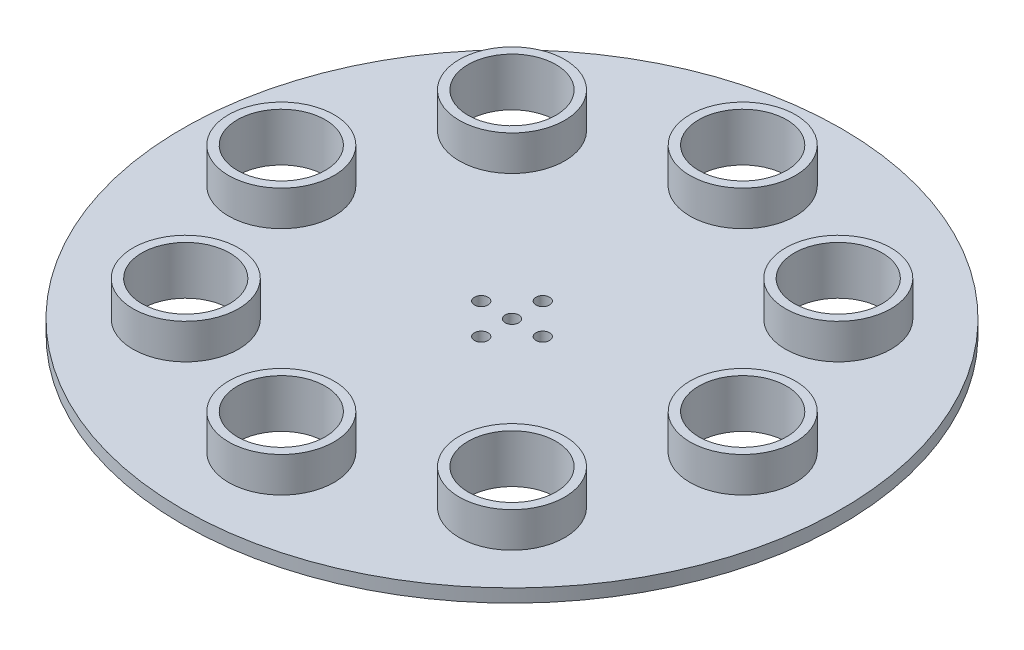
ISO-10303-21;
HEADER;
FILE_DESCRIPTION(('STEP AP214'),'2;1');
FILE_NAME('part.step','',(''),(''),'','','');
FILE_SCHEMA(('AUTOMOTIVE_DESIGN { 1 0 10303 214 1 1 1 1 }'));
ENDSEC;
DATA;
#1=APPLICATION_CONTEXT('core data for automotive mechanical design processes');
#2=APPLICATION_PROTOCOL_DEFINITION('international standard','automotive_design',2000,#1);
#3=PRODUCT_CONTEXT('',#1,'mechanical');
#4=PRODUCT('Part','Part','',(#3));
#5=PRODUCT_RELATED_PRODUCT_CATEGORY('part','',(#4));
#6=PRODUCT_DEFINITION_FORMATION('','',#4);
#7=PRODUCT_DEFINITION_CONTEXT('part definition',#1,'design');
#8=PRODUCT_DEFINITION('design','',#6,#7);
#9=PRODUCT_DEFINITION_SHAPE('','',#8);
#10=(LENGTH_UNIT() NAMED_UNIT(*) SI_UNIT(.MILLI.,.METRE.));
#11=(NAMED_UNIT(*) PLANE_ANGLE_UNIT() SI_UNIT($,.RADIAN.));
#12=(NAMED_UNIT(*) SI_UNIT($,.STERADIAN.) SOLID_ANGLE_UNIT());
#13=UNCERTAINTY_MEASURE_WITH_UNIT(LENGTH_MEASURE(1.E-05),#10,'distance_accuracy_value','');
#14=(GEOMETRIC_REPRESENTATION_CONTEXT(3) GLOBAL_UNCERTAINTY_ASSIGNED_CONTEXT((#13)) GLOBAL_UNIT_ASSIGNED_CONTEXT((#10,
#11,#12)) REPRESENTATION_CONTEXT('',''));
#15=CARTESIAN_POINT('',(0.,0.,0.));
#16=DIRECTION('',(0.,0.,1.));
#17=DIRECTION('',(1.,0.,0.));
#18=AXIS2_PLACEMENT_3D('',#15,#16,#17);
#19=CARTESIAN_POINT('',(0.,3.,0.));
#20=DIRECTION('',(0.,-1.,0.));
#21=DIRECTION('',(0.,0.,-1.));
#22=AXIS2_PLACEMENT_3D('',#19,#20,#21);
#23=CYLINDRICAL_SURFACE('',#22,1.55);
#24=CARTESIAN_POINT('',(0.,3.,0.));
#25=DIRECTION('',(0.,1.,0.));
#26=DIRECTION('',(0.,0.,1.));
#27=AXIS2_PLACEMENT_3D('',#24,#25,#26);
#28=CIRCLE('',#27,1.55);
#29=CARTESIAN_POINT('',(0.,3.,1.55));
#30=VERTEX_POINT('',#29);
#31=EDGE_CURVE('E56',#30,#30,#28,.T.);
#32=ORIENTED_EDGE('',*,*,#31,.T.);
#33=EDGE_LOOP('',(#32));
#34=FACE_BOUND('',#33,.T.);
#35=CARTESIAN_POINT('',(0.,0.,0.));
#36=DIRECTION('',(0.,1.,0.));
#37=DIRECTION('',(0.,0.,1.));
#38=AXIS2_PLACEMENT_3D('',#35,#36,#37);
#39=CIRCLE('',#38,1.55);
#40=CARTESIAN_POINT('',(0.,0.,1.55));
#41=VERTEX_POINT('',#40);
#42=EDGE_CURVE('E100',#41,#41,#39,.T.);
#43=ORIENTED_EDGE('',*,*,#42,.F.);
#44=EDGE_LOOP('',(#43));
#45=FACE_BOUND('',#44,.T.);
#46=ADVANCED_FACE('F48',(#34,#45),#23,.F.);
#47=CARTESIAN_POINT('',(0.,3.,-7.));
#48=DIRECTION('',(0.,-1.,0.));
#49=DIRECTION('',(0.,0.,-1.));
#50=AXIS2_PLACEMENT_3D('',#47,#48,#49);
#51=CYLINDRICAL_SURFACE('',#50,1.55);
#52=CARTESIAN_POINT('',(0.,3.,-7.));
#53=DIRECTION('',(0.,1.,0.));
#54=DIRECTION('',(0.,0.,1.));
#55=AXIS2_PLACEMENT_3D('',#52,#53,#54);
#56=CIRCLE('',#55,1.55);
#57=CARTESIAN_POINT('',(0.,3.,-5.45));
#58=VERTEX_POINT('',#57);
#59=EDGE_CURVE('E61',#58,#58,#56,.T.);
#60=ORIENTED_EDGE('',*,*,#59,.T.);
#61=EDGE_LOOP('',(#60));
#62=FACE_BOUND('',#61,.T.);
#63=CARTESIAN_POINT('',(0.,0.,-7.));
#64=DIRECTION('',(0.,1.,0.));
#65=DIRECTION('',(0.,0.,1.));
#66=AXIS2_PLACEMENT_3D('',#63,#64,#65);
#67=CIRCLE('',#66,1.55);
#68=CARTESIAN_POINT('',(0.,0.,-5.45));
#69=VERTEX_POINT('',#68);
#70=EDGE_CURVE('E98',#69,#69,#67,.T.);
#71=ORIENTED_EDGE('',*,*,#70,.F.);
#72=EDGE_LOOP('',(#71));
#73=FACE_BOUND('',#72,.T.);
#74=ADVANCED_FACE('F145',(#62,#73),#51,.F.);
#75=CARTESIAN_POINT('',(7.,3.,0.));
#76=DIRECTION('',(0.,-1.,0.));
#77=DIRECTION('',(0.,0.,-1.));
#78=AXIS2_PLACEMENT_3D('',#75,#76,#77);
#79=CYLINDRICAL_SURFACE('',#78,1.55);
#80=CARTESIAN_POINT('',(7.,3.,0.));
#81=DIRECTION('',(0.,1.,0.));
#82=DIRECTION('',(0.,0.,1.));
#83=AXIS2_PLACEMENT_3D('',#80,#81,#82);
#84=CIRCLE('',#83,1.55);
#85=CARTESIAN_POINT('',(7.,3.,1.55));
#86=VERTEX_POINT('',#85);
#87=EDGE_CURVE('E140',#86,#86,#84,.T.);
#88=ORIENTED_EDGE('',*,*,#87,.T.);
#89=EDGE_LOOP('',(#88));
#90=FACE_BOUND('',#89,.T.);
#91=CARTESIAN_POINT('',(7.,0.,0.));
#92=DIRECTION('',(0.,1.,0.));
#93=DIRECTION('',(0.,0.,1.));
#94=AXIS2_PLACEMENT_3D('',#91,#92,#93);
#95=CIRCLE('',#94,1.55);
#96=CARTESIAN_POINT('',(7.,0.,1.55));
#97=VERTEX_POINT('',#96);
#98=EDGE_CURVE('E95',#97,#97,#95,.T.);
#99=ORIENTED_EDGE('',*,*,#98,.F.);
#100=EDGE_LOOP('',(#99));
#101=FACE_BOUND('',#100,.T.);
#102=ADVANCED_FACE('F163',(#90,#101),#79,.F.);
#103=CARTESIAN_POINT('',(-7.,3.,0.));
#104=DIRECTION('',(0.,-1.,0.));
#105=DIRECTION('',(0.,0.,-1.));
#106=AXIS2_PLACEMENT_3D('',#103,#104,#105);
#107=CYLINDRICAL_SURFACE('',#106,1.55);
#108=CARTESIAN_POINT('',(-7.,3.,0.));
#109=DIRECTION('',(0.,1.,0.));
#110=DIRECTION('',(0.,0.,1.));
#111=AXIS2_PLACEMENT_3D('',#108,#109,#110);
#112=CIRCLE('',#111,1.55);
#113=CARTESIAN_POINT('',(-7.,3.,1.55));
#114=VERTEX_POINT('',#113);
#115=EDGE_CURVE('E137',#114,#114,#112,.T.);
#116=ORIENTED_EDGE('',*,*,#115,.T.);
#117=EDGE_LOOP('',(#116));
#118=FACE_BOUND('',#117,.T.);
#119=CARTESIAN_POINT('',(-7.,0.,0.));
#120=DIRECTION('',(0.,1.,0.));
#121=DIRECTION('',(0.,0.,1.));
#122=AXIS2_PLACEMENT_3D('',#119,#120,#121);
#123=CIRCLE('',#122,1.55);
#124=CARTESIAN_POINT('',(-7.,0.,1.55));
#125=VERTEX_POINT('',#124);
#126=EDGE_CURVE('E92',#125,#125,#123,.T.);
#127=ORIENTED_EDGE('',*,*,#126,.F.);
#128=EDGE_LOOP('',(#127));
#129=FACE_BOUND('',#128,.T.);
#130=ADVANCED_FACE('F170',(#118,#129),#107,.F.);
#131=CARTESIAN_POINT('',(0.,3.,7.));
#132=DIRECTION('',(0.,-1.,0.));
#133=DIRECTION('',(0.,0.,-1.));
#134=AXIS2_PLACEMENT_3D('',#131,#132,#133);
#135=CYLINDRICAL_SURFACE('',#134,1.55);
#136=CARTESIAN_POINT('',(0.,3.,7.));
#137=DIRECTION('',(0.,1.,0.));
#138=DIRECTION('',(0.,0.,1.));
#139=AXIS2_PLACEMENT_3D('',#136,#137,#138);
#140=CIRCLE('',#139,1.55);
#141=CARTESIAN_POINT('',(0.,3.,8.55));
#142=VERTEX_POINT('',#141);
#143=EDGE_CURVE('E134',#142,#142,#140,.T.);
#144=ORIENTED_EDGE('',*,*,#143,.T.);
#145=EDGE_LOOP('',(#144));
#146=FACE_BOUND('',#145,.T.);
#147=CARTESIAN_POINT('',(0.,0.,7.));
#148=DIRECTION('',(0.,1.,0.));
#149=DIRECTION('',(0.,0.,1.));
#150=AXIS2_PLACEMENT_3D('',#147,#148,#149);
#151=CIRCLE('',#150,1.55);
#152=CARTESIAN_POINT('',(0.,0.,8.55));
#153=VERTEX_POINT('',#152);
#154=EDGE_CURVE('E89',#153,#153,#151,.T.);
#155=ORIENTED_EDGE('',*,*,#154,.F.);
#156=EDGE_LOOP('',(#155));
#157=FACE_BOUND('',#156,.T.);
#158=ADVANCED_FACE('F174',(#146,#157),#135,.F.);
#159=CARTESIAN_POINT('',(-37.1231060122939,3.,-37.1231060122935));
#160=DIRECTION('',(0.,-1.,0.));
#161=DIRECTION('',(0.,0.,-1.));
#162=AXIS2_PLACEMENT_3D('',#159,#160,#161);
#163=CYLINDRICAL_SURFACE('',#162,12.);
#164=CARTESIAN_POINT('',(-37.1231060122939,3.,-37.1231060122935));
#165=DIRECTION('',(0.,1.,0.));
#166=DIRECTION('',(0.,0.,1.));
#167=AXIS2_PLACEMENT_3D('',#164,#165,#166);
#168=CIRCLE('',#167,12.);
#169=CARTESIAN_POINT('',(-37.1231060122939,3.,-25.1231060122935));
#170=VERTEX_POINT('',#169);
#171=EDGE_CURVE('E131',#170,#170,#168,.T.);
#172=ORIENTED_EDGE('',*,*,#171,.T.);
#173=EDGE_LOOP('',(#172));
#174=FACE_BOUND('',#173,.T.);
#175=CARTESIAN_POINT('',(-37.1231060122939,0.,-37.1231060122935));
#176=DIRECTION('',(0.,1.,0.));
#177=DIRECTION('',(0.,0.,1.));
#178=AXIS2_PLACEMENT_3D('',#175,#176,#177);
#179=CIRCLE('',#178,12.);
#180=CARTESIAN_POINT('',(-37.1231060122939,0.,-25.1231060122935));
#181=VERTEX_POINT('',#180);
#182=EDGE_CURVE('E86',#181,#181,#179,.T.);
#183=ORIENTED_EDGE('',*,*,#182,.F.);
#184=EDGE_LOOP('',(#183));
#185=FACE_BOUND('',#184,.T.);
#186=ADVANCED_FACE('F178',(#174,#185),#163,.F.);
#187=CARTESIAN_POINT('',(0.,3.,-52.5));
#188=DIRECTION('',(0.,-1.,0.));
#189=DIRECTION('',(0.,0.,-1.));
#190=AXIS2_PLACEMENT_3D('',#187,#188,#189);
#191=CYLINDRICAL_SURFACE('',#190,12.);
#192=CARTESIAN_POINT('',(0.,3.,-52.5));
#193=DIRECTION('',(0.,1.,0.));
#194=DIRECTION('',(0.,0.,1.));
#195=AXIS2_PLACEMENT_3D('',#192,#193,#194);
#196=CIRCLE('',#195,12.);
#197=CARTESIAN_POINT('',(0.,3.,-40.5));
#198=VERTEX_POINT('',#197);
#199=EDGE_CURVE('E128',#198,#198,#196,.T.);
#200=ORIENTED_EDGE('',*,*,#199,.T.);
#201=EDGE_LOOP('',(#200));
#202=FACE_BOUND('',#201,.T.);
#203=CARTESIAN_POINT('',(0.,0.,-52.5));
#204=DIRECTION('',(0.,1.,0.));
#205=DIRECTION('',(0.,0.,1.));
#206=AXIS2_PLACEMENT_3D('',#203,#204,#205);
#207=CIRCLE('',#206,12.);
#208=CARTESIAN_POINT('',(0.,0.,-40.5));
#209=VERTEX_POINT('',#208);
#210=EDGE_CURVE('E83',#209,#209,#207,.T.);
#211=ORIENTED_EDGE('',*,*,#210,.F.);
#212=EDGE_LOOP('',(#211));
#213=FACE_BOUND('',#212,.T.);
#214=ADVANCED_FACE('F182',(#202,#213),#191,.F.);
#215=CARTESIAN_POINT('',(37.1231060122937,3.,-37.1231060122938));
#216=DIRECTION('',(0.,-1.,0.));
#217=DIRECTION('',(0.,0.,-1.));
#218=AXIS2_PLACEMENT_3D('',#215,#216,#217);
#219=CYLINDRICAL_SURFACE('',#218,12.);
#220=CARTESIAN_POINT('',(37.1231060122937,3.,-37.1231060122938));
#221=DIRECTION('',(0.,1.,0.));
#222=DIRECTION('',(0.,0.,1.));
#223=AXIS2_PLACEMENT_3D('',#220,#221,#222);
#224=CIRCLE('',#223,12.);
#225=CARTESIAN_POINT('',(37.1231060122937,3.,-25.1231060122938));
#226=VERTEX_POINT('',#225);
#227=EDGE_CURVE('E125',#226,#226,#224,.T.);
#228=ORIENTED_EDGE('',*,*,#227,.T.);
#229=EDGE_LOOP('',(#228));
#230=FACE_BOUND('',#229,.T.);
#231=CARTESIAN_POINT('',(37.1231060122937,0.,-37.1231060122938));
#232=DIRECTION('',(0.,1.,0.));
#233=DIRECTION('',(0.,0.,1.));
#234=AXIS2_PLACEMENT_3D('',#231,#232,#233);
#235=CIRCLE('',#234,12.);
#236=CARTESIAN_POINT('',(37.1231060122937,0.,-25.1231060122938));
#237=VERTEX_POINT('',#236);
#238=EDGE_CURVE('E80',#237,#237,#235,.T.);
#239=ORIENTED_EDGE('',*,*,#238,.F.);
#240=EDGE_LOOP('',(#239));
#241=FACE_BOUND('',#240,.T.);
#242=ADVANCED_FACE('F186',(#230,#241),#219,.F.);
#243=CARTESIAN_POINT('',(52.5,3.,0.));
#244=DIRECTION('',(0.,-1.,0.));
#245=DIRECTION('',(0.,0.,-1.));
#246=AXIS2_PLACEMENT_3D('',#243,#244,#245);
#247=CYLINDRICAL_SURFACE('',#246,12.);
#248=CARTESIAN_POINT('',(52.5,3.,0.));
#249=DIRECTION('',(0.,1.,0.));
#250=DIRECTION('',(0.,0.,1.));
#251=AXIS2_PLACEMENT_3D('',#248,#249,#250);
#252=CIRCLE('',#251,12.);
#253=CARTESIAN_POINT('',(52.5,3.,12.));
#254=VERTEX_POINT('',#253);
#255=EDGE_CURVE('E122',#254,#254,#252,.T.);
#256=ORIENTED_EDGE('',*,*,#255,.T.);
#257=EDGE_LOOP('',(#256));
#258=FACE_BOUND('',#257,.T.);
#259=CARTESIAN_POINT('',(52.5,0.,0.));
#260=DIRECTION('',(0.,1.,0.));
#261=DIRECTION('',(0.,0.,1.));
#262=AXIS2_PLACEMENT_3D('',#259,#260,#261);
#263=CIRCLE('',#262,12.);
#264=CARTESIAN_POINT('',(52.5,0.,12.));
#265=VERTEX_POINT('',#264);
#266=EDGE_CURVE('E77',#265,#265,#263,.T.);
#267=ORIENTED_EDGE('',*,*,#266,.F.);
#268=EDGE_LOOP('',(#267));
#269=FACE_BOUND('',#268,.T.);
#270=ADVANCED_FACE('F190',(#258,#269),#247,.F.);
#271=CARTESIAN_POINT('',(37.1231060122937,3.,37.1231060122937));
#272=DIRECTION('',(0.,-1.,0.));
#273=DIRECTION('',(0.,0.,-1.));
#274=AXIS2_PLACEMENT_3D('',#271,#272,#273);
#275=CYLINDRICAL_SURFACE('',#274,12.);
#276=CARTESIAN_POINT('',(37.1231060122937,3.,37.1231060122937));
#277=DIRECTION('',(0.,1.,0.));
#278=DIRECTION('',(0.,0.,1.));
#279=AXIS2_PLACEMENT_3D('',#276,#277,#278);
#280=CIRCLE('',#279,12.);
#281=CARTESIAN_POINT('',(37.1231060122937,3.,49.1231060122937));
#282=VERTEX_POINT('',#281);
#283=EDGE_CURVE('E119',#282,#282,#280,.T.);
#284=ORIENTED_EDGE('',*,*,#283,.T.);
#285=EDGE_LOOP('',(#284));
#286=FACE_BOUND('',#285,.T.);
#287=CARTESIAN_POINT('',(37.1231060122937,0.,37.1231060122937));
#288=DIRECTION('',(0.,1.,0.));
#289=DIRECTION('',(0.,0.,1.));
#290=AXIS2_PLACEMENT_3D('',#287,#288,#289);
#291=CIRCLE('',#290,12.);
#292=CARTESIAN_POINT('',(37.1231060122937,0.,49.1231060122937));
#293=VERTEX_POINT('',#292);
#294=EDGE_CURVE('E74',#293,#293,#291,.T.);
#295=ORIENTED_EDGE('',*,*,#294,.F.);
#296=EDGE_LOOP('',(#295));
#297=FACE_BOUND('',#296,.T.);
#298=ADVANCED_FACE('F194',(#286,#297),#275,.F.);
#299=CARTESIAN_POINT('',(0.,3.,52.5));
#300=DIRECTION('',(0.,-1.,0.));
#301=DIRECTION('',(0.,0.,-1.));
#302=AXIS2_PLACEMENT_3D('',#299,#300,#301);
#303=CYLINDRICAL_SURFACE('',#302,12.);
#304=CARTESIAN_POINT('',(0.,3.,52.5));
#305=DIRECTION('',(0.,1.,0.));
#306=DIRECTION('',(0.,0.,1.));
#307=AXIS2_PLACEMENT_3D('',#304,#305,#306);
#308=CIRCLE('',#307,12.);
#309=CARTESIAN_POINT('',(0.,3.,64.5));
#310=VERTEX_POINT('',#309);
#311=EDGE_CURVE('E114',#310,#310,#308,.T.);
#312=ORIENTED_EDGE('',*,*,#311,.T.);
#313=EDGE_LOOP('',(#312));
#314=FACE_BOUND('',#313,.T.);
#315=CARTESIAN_POINT('',(0.,0.,52.5));
#316=DIRECTION('',(0.,1.,0.));
#317=DIRECTION('',(0.,0.,1.));
#318=AXIS2_PLACEMENT_3D('',#315,#316,#317);
#319=CIRCLE('',#318,12.);
#320=CARTESIAN_POINT('',(0.,0.,64.5));
#321=VERTEX_POINT('',#320);
#322=EDGE_CURVE('E71',#321,#321,#319,.T.);
#323=ORIENTED_EDGE('',*,*,#322,.F.);
#324=EDGE_LOOP('',(#323));
#325=FACE_BOUND('',#324,.T.);
#326=ADVANCED_FACE('F198',(#314,#325),#303,.F.);
#327=CARTESIAN_POINT('',(-37.1231060122938,3.,37.1231060122937));
#328=DIRECTION('',(0.,-1.,0.));
#329=DIRECTION('',(0.,0.,-1.));
#330=AXIS2_PLACEMENT_3D('',#327,#328,#329);
#331=CYLINDRICAL_SURFACE('',#330,12.);
#332=CARTESIAN_POINT('',(-37.1231060122938,3.,37.1231060122937));
#333=DIRECTION('',(0.,1.,0.));
#334=DIRECTION('',(0.,0.,1.));
#335=AXIS2_PLACEMENT_3D('',#332,#333,#334);
#336=CIRCLE('',#335,12.);
#337=CARTESIAN_POINT('',(-37.1231060122938,3.,49.1231060122937));
#338=VERTEX_POINT('',#337);
#339=EDGE_CURVE('E109',#338,#338,#336,.T.);
#340=ORIENTED_EDGE('',*,*,#339,.T.);
#341=EDGE_LOOP('',(#340));
#342=FACE_BOUND('',#341,.T.);
#343=CARTESIAN_POINT('',(-37.1231060122938,0.,37.1231060122937));
#344=DIRECTION('',(0.,1.,0.));
#345=DIRECTION('',(0.,0.,1.));
#346=AXIS2_PLACEMENT_3D('',#343,#344,#345);
#347=CIRCLE('',#346,12.);
#348=CARTESIAN_POINT('',(-37.1231060122938,0.,49.1231060122937));
#349=VERTEX_POINT('',#348);
#350=EDGE_CURVE('E68',#349,#349,#347,.T.);
#351=ORIENTED_EDGE('',*,*,#350,.F.);
#352=EDGE_LOOP('',(#351));
#353=FACE_BOUND('',#352,.T.);
#354=ADVANCED_FACE('F201',(#342,#353),#331,.F.);
#355=CARTESIAN_POINT('',(-52.5,3.,0.));
#356=DIRECTION('',(0.,-1.,0.));
#357=DIRECTION('',(0.,0.,-1.));
#358=AXIS2_PLACEMENT_3D('',#355,#356,#357);
#359=CYLINDRICAL_SURFACE('',#358,12.);
#360=CARTESIAN_POINT('',(-52.5,3.,0.));
#361=DIRECTION('',(0.,1.,0.));
#362=DIRECTION('',(0.,0.,1.));
#363=AXIS2_PLACEMENT_3D('',#360,#361,#362);
#364=CIRCLE('',#363,12.);
#365=CARTESIAN_POINT('',(-52.5,3.,12.));
#366=VERTEX_POINT('',#365);
#367=EDGE_CURVE('E105',#366,#366,#364,.T.);
#368=ORIENTED_EDGE('',*,*,#367,.T.);
#369=EDGE_LOOP('',(#368));
#370=FACE_BOUND('',#369,.T.);
#371=CARTESIAN_POINT('',(-52.5,0.,0.));
#372=DIRECTION('',(0.,1.,0.));
#373=DIRECTION('',(0.,0.,1.));
#374=AXIS2_PLACEMENT_3D('',#371,#372,#373);
#375=CIRCLE('',#374,12.);
#376=CARTESIAN_POINT('',(-52.5,0.,12.));
#377=VERTEX_POINT('',#376);
#378=EDGE_CURVE('E65',#377,#377,#375,.T.);
#379=ORIENTED_EDGE('',*,*,#378,.F.);
#380=EDGE_LOOP('',(#379));
#381=FACE_BOUND('',#380,.T.);
#382=ADVANCED_FACE('F50',(#370,#381),#359,.F.);
#383=CARTESIAN_POINT('',(0.,3.,0.));
#384=DIRECTION('',(0.,-1.,0.));
#385=DIRECTION('',(0.,0.,-1.));
#386=AXIS2_PLACEMENT_3D('',#383,#384,#385);
#387=CYLINDRICAL_SURFACE('',#386,75.);
#388=CARTESIAN_POINT('',(0.,3.,0.));
#389=DIRECTION('',(0.,1.,0.));
#390=DIRECTION('',(0.,0.,1.));
#391=AXIS2_PLACEMENT_3D('',#388,#389,#390);
#392=CIRCLE('',#391,75.);
#393=CARTESIAN_POINT('',(0.,3.,75.));
#394=VERTEX_POINT('',#393);
#395=EDGE_CURVE('E11',#394,#394,#392,.T.);
#396=ORIENTED_EDGE('',*,*,#395,.F.);
#397=EDGE_LOOP('',(#396));
#398=FACE_BOUND('',#397,.T.);
#399=CARTESIAN_POINT('',(0.,0.,0.));
#400=DIRECTION('',(0.,1.,0.));
#401=DIRECTION('',(0.,0.,1.));
#402=AXIS2_PLACEMENT_3D('',#399,#400,#401);
#403=CIRCLE('',#402,75.);
#404=CARTESIAN_POINT('',(0.,0.,75.));
#405=VERTEX_POINT('',#404);
#406=EDGE_CURVE('E52',#405,#405,#403,.T.);
#407=ORIENTED_EDGE('',*,*,#406,.T.);
#408=EDGE_LOOP('',(#407));
#409=FACE_BOUND('',#408,.T.);
#410=ADVANCED_FACE('F152',(#398,#409),#387,.T.);
#411=CARTESIAN_POINT('',(0.,3.,0.));
#412=DIRECTION('',(0.,1.,0.));
#413=DIRECTION('',(0.,0.,1.));
#414=AXIS2_PLACEMENT_3D('',#411,#412,#413);
#415=PLANE('',#414);
#416=ORIENTED_EDGE('',*,*,#367,.F.);
#417=EDGE_LOOP('',(#416));
#418=FACE_BOUND('',#417,.T.);
#419=ORIENTED_EDGE('',*,*,#339,.F.);
#420=EDGE_LOOP('',(#419));
#421=FACE_BOUND('',#420,.T.);
#422=ORIENTED_EDGE('',*,*,#311,.F.);
#423=EDGE_LOOP('',(#422));
#424=FACE_BOUND('',#423,.T.);
#425=ORIENTED_EDGE('',*,*,#283,.F.);
#426=EDGE_LOOP('',(#425));
#427=FACE_BOUND('',#426,.T.);
#428=ORIENTED_EDGE('',*,*,#255,.F.);
#429=EDGE_LOOP('',(#428));
#430=FACE_BOUND('',#429,.T.);
#431=ORIENTED_EDGE('',*,*,#227,.F.);
#432=EDGE_LOOP('',(#431));
#433=FACE_BOUND('',#432,.T.);
#434=ORIENTED_EDGE('',*,*,#199,.F.);
#435=EDGE_LOOP('',(#434));
#436=FACE_BOUND('',#435,.T.);
#437=ORIENTED_EDGE('',*,*,#171,.F.);
#438=EDGE_LOOP('',(#437));
#439=FACE_BOUND('',#438,.T.);
#440=ORIENTED_EDGE('',*,*,#143,.F.);
#441=EDGE_LOOP('',(#440));
#442=FACE_BOUND('',#441,.T.);
#443=ORIENTED_EDGE('',*,*,#115,.F.);
#444=EDGE_LOOP('',(#443));
#445=FACE_BOUND('',#444,.T.);
#446=ORIENTED_EDGE('',*,*,#87,.F.);
#447=EDGE_LOOP('',(#446));
#448=FACE_BOUND('',#447,.T.);
#449=ORIENTED_EDGE('',*,*,#59,.F.);
#450=EDGE_LOOP('',(#449));
#451=FACE_BOUND('',#450,.T.);
#452=ORIENTED_EDGE('',*,*,#31,.F.);
#453=EDGE_LOOP('',(#452));
#454=FACE_BOUND('',#453,.T.);
#455=ORIENTED_EDGE('',*,*,#395,.T.);
#456=EDGE_LOOP('',(#455));
#457=FACE_BOUND('',#456,.T.);
#458=ADVANCED_FACE('F148',(#418,#421,#424,#427,#430,#433,#436,#439,#442,#445,#448,#451,#454,
#457),#415,.T.);
#459=CARTESIAN_POINT('',(0.,0.,0.));
#460=DIRECTION('',(0.,1.,0.));
#461=DIRECTION('',(0.,0.,1.));
#462=AXIS2_PLACEMENT_3D('',#459,#460,#461);
#463=PLANE('',#462);
#464=ORIENTED_EDGE('',*,*,#378,.T.);
#465=EDGE_LOOP('',(#464));
#466=FACE_BOUND('',#465,.T.);
#467=ORIENTED_EDGE('',*,*,#350,.T.);
#468=EDGE_LOOP('',(#467));
#469=FACE_BOUND('',#468,.T.);
#470=ORIENTED_EDGE('',*,*,#322,.T.);
#471=EDGE_LOOP('',(#470));
#472=FACE_BOUND('',#471,.T.);
#473=ORIENTED_EDGE('',*,*,#294,.T.);
#474=EDGE_LOOP('',(#473));
#475=FACE_BOUND('',#474,.T.);
#476=ORIENTED_EDGE('',*,*,#266,.T.);
#477=EDGE_LOOP('',(#476));
#478=FACE_BOUND('',#477,.T.);
#479=ORIENTED_EDGE('',*,*,#238,.T.);
#480=EDGE_LOOP('',(#479));
#481=FACE_BOUND('',#480,.T.);
#482=ORIENTED_EDGE('',*,*,#210,.T.);
#483=EDGE_LOOP('',(#482));
#484=FACE_BOUND('',#483,.T.);
#485=ORIENTED_EDGE('',*,*,#182,.T.);
#486=EDGE_LOOP('',(#485));
#487=FACE_BOUND('',#486,.T.);
#488=ORIENTED_EDGE('',*,*,#154,.T.);
#489=EDGE_LOOP('',(#488));
#490=FACE_BOUND('',#489,.T.);
#491=ORIENTED_EDGE('',*,*,#126,.T.);
#492=EDGE_LOOP('',(#491));
#493=FACE_BOUND('',#492,.T.);
#494=ORIENTED_EDGE('',*,*,#98,.T.);
#495=EDGE_LOOP('',(#494));
#496=FACE_BOUND('',#495,.T.);
#497=ORIENTED_EDGE('',*,*,#70,.T.);
#498=EDGE_LOOP('',(#497));
#499=FACE_BOUND('',#498,.T.);
#500=ORIENTED_EDGE('',*,*,#42,.T.);
#501=EDGE_LOOP('',(#500));
#502=FACE_BOUND('',#501,.T.);
#503=ORIENTED_EDGE('',*,*,#406,.F.);
#504=EDGE_LOOP('',(#503));
#505=FACE_BOUND('',#504,.T.);
#506=ADVANCED_FACE('F151',(#466,#469,#472,#475,#478,#481,#484,#487,#490,#493,#496,#499,#502,
#505),#463,.F.);
#507=CLOSED_SHELL('',(#46,#74,#102,#130,#158,#186,#214,#242,#270,#298,#326,#354,#382,#410,#458,#506));
#508=MANIFOLD_SOLID_BREP('B2',#507);
#509=CARTESIAN_POINT('',(-37.1231060122939,11.,-37.1231060122935));
#510=DIRECTION('',(0.,-1.,0.));
#511=DIRECTION('',(0.,0.,-1.));
#512=AXIS2_PLACEMENT_3D('',#509,#510,#511);
#513=CYLINDRICAL_SURFACE('',#512,10.);
#514=CARTESIAN_POINT('',(-37.1231060122939,11.,-37.1231060122935));
#515=DIRECTION('',(0.,1.,0.));
#516=DIRECTION('',(0.,0.,1.));
#517=AXIS2_PLACEMENT_3D('',#514,#515,#516);
#518=CIRCLE('',#517,10.);
#519=CARTESIAN_POINT('',(-37.1231060122939,11.,-27.1231060122935));
#520=VERTEX_POINT('',#519);
#521=EDGE_CURVE('E409',#520,#520,#518,.T.);
#522=ORIENTED_EDGE('',*,*,#521,.T.);
#523=EDGE_LOOP('',(#522));
#524=FACE_BOUND('',#523,.T.);
#525=CARTESIAN_POINT('',(-37.1231060122939,0.,-37.1231060122935));
#526=DIRECTION('',(0.,1.,0.));
#527=DIRECTION('',(0.,0.,1.));
#528=AXIS2_PLACEMENT_3D('',#525,#526,#527);
#529=CIRCLE('',#528,10.);
#530=CARTESIAN_POINT('',(-37.1231060122939,0.,-27.1231060122935));
#531=VERTEX_POINT('',#530);
#532=EDGE_CURVE('E415',#531,#531,#529,.T.);
#533=ORIENTED_EDGE('',*,*,#532,.F.);
#534=EDGE_LOOP('',(#533));
#535=FACE_BOUND('',#534,.T.);
#536=ADVANCED_FACE('F402',(#524,#535),#513,.F.);
#537=CARTESIAN_POINT('',(-37.1231060122939,11.,-37.1231060122935));
#538=DIRECTION('',(0.,-1.,0.));
#539=DIRECTION('',(0.,0.,-1.));
#540=AXIS2_PLACEMENT_3D('',#537,#538,#539);
#541=CYLINDRICAL_SURFACE('',#540,12.);
#542=CARTESIAN_POINT('',(-37.1231060122939,11.,-37.1231060122935));
#543=DIRECTION('',(0.,1.,0.));
#544=DIRECTION('',(0.,0.,1.));
#545=AXIS2_PLACEMENT_3D('',#542,#543,#544);
#546=CIRCLE('',#545,12.);
#547=CARTESIAN_POINT('',(-37.1231060122939,11.,-25.1231060122935));
#548=VERTEX_POINT('',#547);
#549=EDGE_CURVE('E47',#548,#548,#546,.T.);
#550=ORIENTED_EDGE('',*,*,#549,.F.);
#551=EDGE_LOOP('',(#550));
#552=FACE_BOUND('',#551,.T.);
#553=CARTESIAN_POINT('',(-37.1231060122939,0.,-37.1231060122935));
#554=DIRECTION('',(0.,1.,0.));
#555=DIRECTION('',(0.,0.,1.));
#556=AXIS2_PLACEMENT_3D('',#553,#554,#555);
#557=CIRCLE('',#556,12.);
#558=CARTESIAN_POINT('',(-37.1231060122939,0.,-25.1231060122935));
#559=VERTEX_POINT('',#558);
#560=EDGE_CURVE('E405',#559,#559,#557,.T.);
#561=ORIENTED_EDGE('',*,*,#560,.T.);
#562=EDGE_LOOP('',(#561));
#563=FACE_BOUND('',#562,.T.);
#564=ADVANCED_FACE('F422',(#552,#563),#541,.T.);
#565=CARTESIAN_POINT('',(0.,11.,0.));
#566=DIRECTION('',(0.,1.,0.));
#567=DIRECTION('',(0.,0.,1.));
#568=AXIS2_PLACEMENT_3D('',#565,#566,#567);
#569=PLANE('',#568);
#570=ORIENTED_EDGE('',*,*,#521,.F.);
#571=EDGE_LOOP('',(#570));
#572=FACE_BOUND('',#571,.T.);
#573=ORIENTED_EDGE('',*,*,#549,.T.);
#574=EDGE_LOOP('',(#573));
#575=FACE_BOUND('',#574,.T.);
#576=ADVANCED_FACE('F426',(#572,#575),#569,.T.);
#577=CARTESIAN_POINT('',(0.,0.,0.));
#578=DIRECTION('',(0.,1.,0.));
#579=DIRECTION('',(0.,0.,1.));
#580=AXIS2_PLACEMENT_3D('',#577,#578,#579);
#581=PLANE('',#580);
#582=ORIENTED_EDGE('',*,*,#532,.T.);
#583=EDGE_LOOP('',(#582));
#584=FACE_BOUND('',#583,.T.);
#585=ORIENTED_EDGE('',*,*,#560,.F.);
#586=EDGE_LOOP('',(#585));
#587=FACE_BOUND('',#586,.T.);
#588=ADVANCED_FACE('F424',(#584,#587),#581,.F.);
#589=CLOSED_SHELL('',(#536,#564,#576,#588));
#590=MANIFOLD_SOLID_BREP('B6',#589);
#591=CARTESIAN_POINT('',(37.1231060122937,11.,-37.1231060122938));
#592=DIRECTION('',(0.,-1.,0.));
#593=DIRECTION('',(0.,0.,-1.));
#594=AXIS2_PLACEMENT_3D('',#591,#592,#593);
#595=CYLINDRICAL_SURFACE('',#594,10.);
#596=CARTESIAN_POINT('',(37.1231060122937,11.,-37.1231060122938));
#597=DIRECTION('',(0.,1.,0.));
#598=DIRECTION('',(0.,0.,1.));
#599=AXIS2_PLACEMENT_3D('',#596,#597,#598);
#600=CIRCLE('',#599,10.);
#601=CARTESIAN_POINT('',(37.1231060122937,11.,-27.1231060122938));
#602=VERTEX_POINT('',#601);
#603=EDGE_CURVE('E487',#602,#602,#600,.T.);
#604=ORIENTED_EDGE('',*,*,#603,.T.);
#605=EDGE_LOOP('',(#604));
#606=FACE_BOUND('',#605,.T.);
#607=CARTESIAN_POINT('',(37.1231060122937,0.,-37.1231060122938));
#608=DIRECTION('',(0.,1.,0.));
#609=DIRECTION('',(0.,0.,1.));
#610=AXIS2_PLACEMENT_3D('',#607,#608,#609);
#611=CIRCLE('',#610,10.);
#612=CARTESIAN_POINT('',(37.1231060122937,0.,-27.1231060122938));
#613=VERTEX_POINT('',#612);
#614=EDGE_CURVE('E493',#613,#613,#611,.T.);
#615=ORIENTED_EDGE('',*,*,#614,.F.);
#616=EDGE_LOOP('',(#615));
#617=FACE_BOUND('',#616,.T.);
#618=ADVANCED_FACE('F480',(#606,#617),#595,.F.);
#619=CARTESIAN_POINT('',(37.1231060122937,11.,-37.1231060122938));
#620=DIRECTION('',(0.,-1.,0.));
#621=DIRECTION('',(0.,0.,-1.));
#622=AXIS2_PLACEMENT_3D('',#619,#620,#621);
#623=CYLINDRICAL_SURFACE('',#622,12.);
#624=CARTESIAN_POINT('',(37.1231060122937,11.,-37.1231060122938));
#625=DIRECTION('',(0.,1.,0.));
#626=DIRECTION('',(0.,0.,1.));
#627=AXIS2_PLACEMENT_3D('',#624,#625,#626);
#628=CIRCLE('',#627,12.);
#629=CARTESIAN_POINT('',(37.1231060122937,11.,-25.1231060122938));
#630=VERTEX_POINT('',#629);
#631=EDGE_CURVE('E401',#630,#630,#628,.T.);
#632=ORIENTED_EDGE('',*,*,#631,.F.);
#633=EDGE_LOOP('',(#632));
#634=FACE_BOUND('',#633,.T.);
#635=CARTESIAN_POINT('',(37.1231060122937,0.,-37.1231060122938));
#636=DIRECTION('',(0.,1.,0.));
#637=DIRECTION('',(0.,0.,1.));
#638=AXIS2_PLACEMENT_3D('',#635,#636,#637);
#639=CIRCLE('',#638,12.);
#640=CARTESIAN_POINT('',(37.1231060122937,0.,-25.1231060122938));
#641=VERTEX_POINT('',#640);
#642=EDGE_CURVE('E483',#641,#641,#639,.T.);
#643=ORIENTED_EDGE('',*,*,#642,.T.);
#644=EDGE_LOOP('',(#643));
#645=FACE_BOUND('',#644,.T.);
#646=ADVANCED_FACE('F500',(#634,#645),#623,.T.);
#647=CARTESIAN_POINT('',(0.,11.,0.));
#648=DIRECTION('',(0.,1.,0.));
#649=DIRECTION('',(0.,0.,1.));
#650=AXIS2_PLACEMENT_3D('',#647,#648,#649);
#651=PLANE('',#650);
#652=ORIENTED_EDGE('',*,*,#603,.F.);
#653=EDGE_LOOP('',(#652));
#654=FACE_BOUND('',#653,.T.);
#655=ORIENTED_EDGE('',*,*,#631,.T.);
#656=EDGE_LOOP('',(#655));
#657=FACE_BOUND('',#656,.T.);
#658=ADVANCED_FACE('F504',(#654,#657),#651,.T.);
#659=CARTESIAN_POINT('',(0.,0.,0.));
#660=DIRECTION('',(0.,1.,0.));
#661=DIRECTION('',(0.,0.,1.));
#662=AXIS2_PLACEMENT_3D('',#659,#660,#661);
#663=PLANE('',#662);
#664=ORIENTED_EDGE('',*,*,#614,.T.);
#665=EDGE_LOOP('',(#664));
#666=FACE_BOUND('',#665,.T.);
#667=ORIENTED_EDGE('',*,*,#642,.F.);
#668=EDGE_LOOP('',(#667));
#669=FACE_BOUND('',#668,.T.);
#670=ADVANCED_FACE('F502',(#666,#669),#663,.F.);
#671=CLOSED_SHELL('',(#618,#646,#658,#670));
#672=MANIFOLD_SOLID_BREP('B42',#671);
#673=CARTESIAN_POINT('',(0.,11.,-52.5));
#674=DIRECTION('',(0.,-1.,0.));
#675=DIRECTION('',(0.,0.,-1.));
#676=AXIS2_PLACEMENT_3D('',#673,#674,#675);
#677=CYLINDRICAL_SURFACE('',#676,10.);
#678=CARTESIAN_POINT('',(0.,11.,-52.5));
#679=DIRECTION('',(0.,1.,0.));
#680=DIRECTION('',(0.,0.,1.));
#681=AXIS2_PLACEMENT_3D('',#678,#679,#680);
#682=CIRCLE('',#681,10.);
#683=CARTESIAN_POINT('',(0.,11.,-42.5));
#684=VERTEX_POINT('',#683);
#685=EDGE_CURVE('E565',#684,#684,#682,.T.);
#686=ORIENTED_EDGE('',*,*,#685,.T.);
#687=EDGE_LOOP('',(#686));
#688=FACE_BOUND('',#687,.T.);
#689=CARTESIAN_POINT('',(0.,0.,-52.5));
#690=DIRECTION('',(0.,1.,0.));
#691=DIRECTION('',(0.,0.,1.));
#692=AXIS2_PLACEMENT_3D('',#689,#690,#691);
#693=CIRCLE('',#692,10.);
#694=CARTESIAN_POINT('',(0.,0.,-42.5));
#695=VERTEX_POINT('',#694);
#696=EDGE_CURVE('E571',#695,#695,#693,.T.);
#697=ORIENTED_EDGE('',*,*,#696,.F.);
#698=EDGE_LOOP('',(#697));
#699=FACE_BOUND('',#698,.T.);
#700=ADVANCED_FACE('F558',(#688,#699),#677,.F.);
#701=CARTESIAN_POINT('',(0.,11.,-52.5));
#702=DIRECTION('',(0.,-1.,0.));
#703=DIRECTION('',(0.,0.,-1.));
#704=AXIS2_PLACEMENT_3D('',#701,#702,#703);
#705=CYLINDRICAL_SURFACE('',#704,12.);
#706=CARTESIAN_POINT('',(0.,11.,-52.5));
#707=DIRECTION('',(0.,1.,0.));
#708=DIRECTION('',(0.,0.,1.));
#709=AXIS2_PLACEMENT_3D('',#706,#707,#708);
#710=CIRCLE('',#709,12.);
#711=CARTESIAN_POINT('',(0.,11.,-40.5));
#712=VERTEX_POINT('',#711);
#713=EDGE_CURVE('E479',#712,#712,#710,.T.);
#714=ORIENTED_EDGE('',*,*,#713,.F.);
#715=EDGE_LOOP('',(#714));
#716=FACE_BOUND('',#715,.T.);
#717=CARTESIAN_POINT('',(0.,0.,-52.5));
#718=DIRECTION('',(0.,1.,0.));
#719=DIRECTION('',(0.,0.,1.));
#720=AXIS2_PLACEMENT_3D('',#717,#718,#719);
#721=CIRCLE('',#720,12.);
#722=CARTESIAN_POINT('',(0.,0.,-40.5));
#723=VERTEX_POINT('',#722);
#724=EDGE_CURVE('E561',#723,#723,#721,.T.);
#725=ORIENTED_EDGE('',*,*,#724,.T.);
#726=EDGE_LOOP('',(#725));
#727=FACE_BOUND('',#726,.T.);
#728=ADVANCED_FACE('F578',(#716,#727),#705,.T.);
#729=CARTESIAN_POINT('',(0.,11.,0.));
#730=DIRECTION('',(0.,1.,0.));
#731=DIRECTION('',(0.,0.,1.));
#732=AXIS2_PLACEMENT_3D('',#729,#730,#731);
#733=PLANE('',#732);
#734=ORIENTED_EDGE('',*,*,#685,.F.);
#735=EDGE_LOOP('',(#734));
#736=FACE_BOUND('',#735,.T.);
#737=ORIENTED_EDGE('',*,*,#713,.T.);
#738=EDGE_LOOP('',(#737));
#739=FACE_BOUND('',#738,.T.);
#740=ADVANCED_FACE('F582',(#736,#739),#733,.T.);
#741=CARTESIAN_POINT('',(0.,0.,0.));
#742=DIRECTION('',(0.,1.,0.));
#743=DIRECTION('',(0.,0.,1.));
#744=AXIS2_PLACEMENT_3D('',#741,#742,#743);
#745=PLANE('',#744);
#746=ORIENTED_EDGE('',*,*,#696,.T.);
#747=EDGE_LOOP('',(#746));
#748=FACE_BOUND('',#747,.T.);
#749=ORIENTED_EDGE('',*,*,#724,.F.);
#750=EDGE_LOOP('',(#749));
#751=FACE_BOUND('',#750,.T.);
#752=ADVANCED_FACE('F580',(#748,#751),#745,.F.);
#753=CLOSED_SHELL('',(#700,#728,#740,#752));
#754=MANIFOLD_SOLID_BREP('B396',#753);
#755=CARTESIAN_POINT('',(52.5,11.,0.));
#756=DIRECTION('',(0.,-1.,0.));
#757=DIRECTION('',(0.,0.,-1.));
#758=AXIS2_PLACEMENT_3D('',#755,#756,#757);
#759=CYLINDRICAL_SURFACE('',#758,9.99999999999999);
#760=CARTESIAN_POINT('',(52.5,11.,0.));
#761=DIRECTION('',(0.,1.,0.));
#762=DIRECTION('',(0.,0.,1.));
#763=AXIS2_PLACEMENT_3D('',#760,#761,#762);
#764=CIRCLE('',#763,9.99999999999999);
#765=CARTESIAN_POINT('',(52.5,11.,9.99999999999999));
#766=VERTEX_POINT('',#765);
#767=EDGE_CURVE('E643',#766,#766,#764,.T.);
#768=ORIENTED_EDGE('',*,*,#767,.T.);
#769=EDGE_LOOP('',(#768));
#770=FACE_BOUND('',#769,.T.);
#771=CARTESIAN_POINT('',(52.5,0.,0.));
#772=DIRECTION('',(0.,1.,0.));
#773=DIRECTION('',(0.,0.,1.));
#774=AXIS2_PLACEMENT_3D('',#771,#772,#773);
#775=CIRCLE('',#774,9.99999999999999);
#776=CARTESIAN_POINT('',(52.5,0.,9.99999999999999));
#777=VERTEX_POINT('',#776);
#778=EDGE_CURVE('E649',#777,#777,#775,.T.);
#779=ORIENTED_EDGE('',*,*,#778,.F.);
#780=EDGE_LOOP('',(#779));
#781=FACE_BOUND('',#780,.T.);
#782=ADVANCED_FACE('F636',(#770,#781),#759,.F.);
#783=CARTESIAN_POINT('',(52.5,11.,0.));
#784=DIRECTION('',(0.,-1.,0.));
#785=DIRECTION('',(0.,0.,-1.));
#786=AXIS2_PLACEMENT_3D('',#783,#784,#785);
#787=CYLINDRICAL_SURFACE('',#786,12.);
#788=CARTESIAN_POINT('',(52.5,11.,0.));
#789=DIRECTION('',(0.,1.,0.));
#790=DIRECTION('',(0.,0.,1.));
#791=AXIS2_PLACEMENT_3D('',#788,#789,#790);
#792=CIRCLE('',#791,12.);
#793=CARTESIAN_POINT('',(52.5,11.,12.));
#794=VERTEX_POINT('',#793);
#795=EDGE_CURVE('E557',#794,#794,#792,.T.);
#796=ORIENTED_EDGE('',*,*,#795,.F.);
#797=EDGE_LOOP('',(#796));
#798=FACE_BOUND('',#797,.T.);
#799=CARTESIAN_POINT('',(52.5,0.,0.));
#800=DIRECTION('',(0.,1.,0.));
#801=DIRECTION('',(0.,0.,1.));
#802=AXIS2_PLACEMENT_3D('',#799,#800,#801);
#803=CIRCLE('',#802,12.);
#804=CARTESIAN_POINT('',(52.5,0.,12.));
#805=VERTEX_POINT('',#804);
#806=EDGE_CURVE('E639',#805,#805,#803,.T.);
#807=ORIENTED_EDGE('',*,*,#806,.T.);
#808=EDGE_LOOP('',(#807));
#809=FACE_BOUND('',#808,.T.);
#810=ADVANCED_FACE('F656',(#798,#809),#787,.T.);
#811=CARTESIAN_POINT('',(0.,11.,0.));
#812=DIRECTION('',(0.,1.,0.));
#813=DIRECTION('',(0.,0.,1.));
#814=AXIS2_PLACEMENT_3D('',#811,#812,#813);
#815=PLANE('',#814);
#816=ORIENTED_EDGE('',*,*,#767,.F.);
#817=EDGE_LOOP('',(#816));
#818=FACE_BOUND('',#817,.T.);
#819=ORIENTED_EDGE('',*,*,#795,.T.);
#820=EDGE_LOOP('',(#819));
#821=FACE_BOUND('',#820,.T.);
#822=ADVANCED_FACE('F660',(#818,#821),#815,.T.);
#823=CARTESIAN_POINT('',(0.,0.,0.));
#824=DIRECTION('',(0.,1.,0.));
#825=DIRECTION('',(0.,0.,1.));
#826=AXIS2_PLACEMENT_3D('',#823,#824,#825);
#827=PLANE('',#826);
#828=ORIENTED_EDGE('',*,*,#778,.T.);
#829=EDGE_LOOP('',(#828));
#830=FACE_BOUND('',#829,.T.);
#831=ORIENTED_EDGE('',*,*,#806,.F.);
#832=EDGE_LOOP('',(#831));
#833=FACE_BOUND('',#832,.T.);
#834=ADVANCED_FACE('F658',(#830,#833),#827,.F.);
#835=CLOSED_SHELL('',(#782,#810,#822,#834));
#836=MANIFOLD_SOLID_BREP('B474',#835);
#837=CARTESIAN_POINT('',(37.1231060122937,11.,37.1231060122937));
#838=DIRECTION('',(0.,-1.,0.));
#839=DIRECTION('',(0.,0.,-1.));
#840=AXIS2_PLACEMENT_3D('',#837,#838,#839);
#841=CYLINDRICAL_SURFACE('',#840,10.);
#842=CARTESIAN_POINT('',(37.1231060122937,11.,37.1231060122937));
#843=DIRECTION('',(0.,1.,0.));
#844=DIRECTION('',(0.,0.,1.));
#845=AXIS2_PLACEMENT_3D('',#842,#843,#844);
#846=CIRCLE('',#845,10.);
#847=CARTESIAN_POINT('',(37.1231060122937,11.,47.1231060122937));
#848=VERTEX_POINT('',#847);
#849=EDGE_CURVE('E721',#848,#848,#846,.T.);
#850=ORIENTED_EDGE('',*,*,#849,.T.);
#851=EDGE_LOOP('',(#850));
#852=FACE_BOUND('',#851,.T.);
#853=CARTESIAN_POINT('',(37.1231060122937,0.,37.1231060122937));
#854=DIRECTION('',(0.,1.,0.));
#855=DIRECTION('',(0.,0.,1.));
#856=AXIS2_PLACEMENT_3D('',#853,#854,#855);
#857=CIRCLE('',#856,10.);
#858=CARTESIAN_POINT('',(37.1231060122937,0.,47.1231060122937));
#859=VERTEX_POINT('',#858);
#860=EDGE_CURVE('E727',#859,#859,#857,.T.);
#861=ORIENTED_EDGE('',*,*,#860,.F.);
#862=EDGE_LOOP('',(#861));
#863=FACE_BOUND('',#862,.T.);
#864=ADVANCED_FACE('F714',(#852,#863),#841,.F.);
#865=CARTESIAN_POINT('',(37.1231060122937,11.,37.1231060122937));
#866=DIRECTION('',(0.,-1.,0.));
#867=DIRECTION('',(0.,0.,-1.));
#868=AXIS2_PLACEMENT_3D('',#865,#866,#867);
#869=CYLINDRICAL_SURFACE('',#868,12.);
#870=CARTESIAN_POINT('',(37.1231060122937,11.,37.1231060122937));
#871=DIRECTION('',(0.,1.,0.));
#872=DIRECTION('',(0.,0.,1.));
#873=AXIS2_PLACEMENT_3D('',#870,#871,#872);
#874=CIRCLE('',#873,12.);
#875=CARTESIAN_POINT('',(37.1231060122937,11.,49.1231060122937));
#876=VERTEX_POINT('',#875);
#877=EDGE_CURVE('E635',#876,#876,#874,.T.);
#878=ORIENTED_EDGE('',*,*,#877,.F.);
#879=EDGE_LOOP('',(#878));
#880=FACE_BOUND('',#879,.T.);
#881=CARTESIAN_POINT('',(37.1231060122937,0.,37.1231060122937));
#882=DIRECTION('',(0.,1.,0.));
#883=DIRECTION('',(0.,0.,1.));
#884=AXIS2_PLACEMENT_3D('',#881,#882,#883);
#885=CIRCLE('',#884,12.);
#886=CARTESIAN_POINT('',(37.1231060122937,0.,49.1231060122937));
#887=VERTEX_POINT('',#886);
#888=EDGE_CURVE('E717',#887,#887,#885,.T.);
#889=ORIENTED_EDGE('',*,*,#888,.T.);
#890=EDGE_LOOP('',(#889));
#891=FACE_BOUND('',#890,.T.);
#892=ADVANCED_FACE('F734',(#880,#891),#869,.T.);
#893=CARTESIAN_POINT('',(0.,11.,0.));
#894=DIRECTION('',(0.,1.,0.));
#895=DIRECTION('',(0.,0.,1.));
#896=AXIS2_PLACEMENT_3D('',#893,#894,#895);
#897=PLANE('',#896);
#898=ORIENTED_EDGE('',*,*,#849,.F.);
#899=EDGE_LOOP('',(#898));
#900=FACE_BOUND('',#899,.T.);
#901=ORIENTED_EDGE('',*,*,#877,.T.);
#902=EDGE_LOOP('',(#901));
#903=FACE_BOUND('',#902,.T.);
#904=ADVANCED_FACE('F738',(#900,#903),#897,.T.);
#905=CARTESIAN_POINT('',(0.,0.,0.));
#906=DIRECTION('',(0.,1.,0.));
#907=DIRECTION('',(0.,0.,1.));
#908=AXIS2_PLACEMENT_3D('',#905,#906,#907);
#909=PLANE('',#908);
#910=ORIENTED_EDGE('',*,*,#860,.T.);
#911=EDGE_LOOP('',(#910));
#912=FACE_BOUND('',#911,.T.);
#913=ORIENTED_EDGE('',*,*,#888,.F.);
#914=EDGE_LOOP('',(#913));
#915=FACE_BOUND('',#914,.T.);
#916=ADVANCED_FACE('F736',(#912,#915),#909,.F.);
#917=CLOSED_SHELL('',(#864,#892,#904,#916));
#918=MANIFOLD_SOLID_BREP('B552',#917);
#919=CARTESIAN_POINT('',(0.,11.,52.5));
#920=DIRECTION('',(0.,-1.,0.));
#921=DIRECTION('',(0.,0.,-1.));
#922=AXIS2_PLACEMENT_3D('',#919,#920,#921);
#923=CYLINDRICAL_SURFACE('',#922,10.);
#924=CARTESIAN_POINT('',(0.,11.,52.5));
#925=DIRECTION('',(0.,1.,0.));
#926=DIRECTION('',(0.,0.,1.));
#927=AXIS2_PLACEMENT_3D('',#924,#925,#926);
#928=CIRCLE('',#927,10.);
#929=CARTESIAN_POINT('',(0.,11.,62.5));
#930=VERTEX_POINT('',#929);
#931=EDGE_CURVE('E799',#930,#930,#928,.T.);
#932=ORIENTED_EDGE('',*,*,#931,.T.);
#933=EDGE_LOOP('',(#932));
#934=FACE_BOUND('',#933,.T.);
#935=CARTESIAN_POINT('',(0.,0.,52.5));
#936=DIRECTION('',(0.,1.,0.));
#937=DIRECTION('',(0.,0.,1.));
#938=AXIS2_PLACEMENT_3D('',#935,#936,#937);
#939=CIRCLE('',#938,10.);
#940=CARTESIAN_POINT('',(0.,0.,62.5));
#941=VERTEX_POINT('',#940);
#942=EDGE_CURVE('E805',#941,#941,#939,.T.);
#943=ORIENTED_EDGE('',*,*,#942,.F.);
#944=EDGE_LOOP('',(#943));
#945=FACE_BOUND('',#944,.T.);
#946=ADVANCED_FACE('F792',(#934,#945),#923,.F.);
#947=CARTESIAN_POINT('',(0.,11.,52.5));
#948=DIRECTION('',(0.,-1.,0.));
#949=DIRECTION('',(0.,0.,-1.));
#950=AXIS2_PLACEMENT_3D('',#947,#948,#949);
#951=CYLINDRICAL_SURFACE('',#950,12.);
#952=CARTESIAN_POINT('',(0.,11.,52.5));
#953=DIRECTION('',(0.,1.,0.));
#954=DIRECTION('',(0.,0.,1.));
#955=AXIS2_PLACEMENT_3D('',#952,#953,#954);
#956=CIRCLE('',#955,12.);
#957=CARTESIAN_POINT('',(0.,11.,64.5));
#958=VERTEX_POINT('',#957);
#959=EDGE_CURVE('E713',#958,#958,#956,.T.);
#960=ORIENTED_EDGE('',*,*,#959,.F.);
#961=EDGE_LOOP('',(#960));
#962=FACE_BOUND('',#961,.T.);
#963=CARTESIAN_POINT('',(0.,0.,52.5));
#964=DIRECTION('',(0.,1.,0.));
#965=DIRECTION('',(0.,0.,1.));
#966=AXIS2_PLACEMENT_3D('',#963,#964,#965);
#967=CIRCLE('',#966,12.);
#968=CARTESIAN_POINT('',(0.,0.,64.5));
#969=VERTEX_POINT('',#968);
#970=EDGE_CURVE('E795',#969,#969,#967,.T.);
#971=ORIENTED_EDGE('',*,*,#970,.T.);
#972=EDGE_LOOP('',(#971));
#973=FACE_BOUND('',#972,.T.);
#974=ADVANCED_FACE('F812',(#962,#973),#951,.T.);
#975=CARTESIAN_POINT('',(0.,11.,0.));
#976=DIRECTION('',(0.,1.,0.));
#977=DIRECTION('',(0.,0.,1.));
#978=AXIS2_PLACEMENT_3D('',#975,#976,#977);
#979=PLANE('',#978);
#980=ORIENTED_EDGE('',*,*,#931,.F.);
#981=EDGE_LOOP('',(#980));
#982=FACE_BOUND('',#981,.T.);
#983=ORIENTED_EDGE('',*,*,#959,.T.);
#984=EDGE_LOOP('',(#983));
#985=FACE_BOUND('',#984,.T.);
#986=ADVANCED_FACE('F816',(#982,#985),#979,.T.);
#987=CARTESIAN_POINT('',(0.,0.,0.));
#988=DIRECTION('',(0.,1.,0.));
#989=DIRECTION('',(0.,0.,1.));
#990=AXIS2_PLACEMENT_3D('',#987,#988,#989);
#991=PLANE('',#990);
#992=ORIENTED_EDGE('',*,*,#942,.T.);
#993=EDGE_LOOP('',(#992));
#994=FACE_BOUND('',#993,.T.);
#995=ORIENTED_EDGE('',*,*,#970,.F.);
#996=EDGE_LOOP('',(#995));
#997=FACE_BOUND('',#996,.T.);
#998=ADVANCED_FACE('F814',(#994,#997),#991,.F.);
#999=CLOSED_SHELL('',(#946,#974,#986,#998));
#1000=MANIFOLD_SOLID_BREP('B630',#999);
#1001=CARTESIAN_POINT('',(-37.1231060122938,11.,37.1231060122937));
#1002=DIRECTION('',(0.,-1.,0.));
#1003=DIRECTION('',(0.,0.,-1.));
#1004=AXIS2_PLACEMENT_3D('',#1001,#1002,#1003);
#1005=CYLINDRICAL_SURFACE('',#1004,10.);
#1006=CARTESIAN_POINT('',(-37.1231060122938,11.,37.1231060122937));
#1007=DIRECTION('',(0.,1.,0.));
#1008=DIRECTION('',(0.,0.,1.));
#1009=AXIS2_PLACEMENT_3D('',#1006,#1007,#1008);
#1010=CIRCLE('',#1009,10.);
#1011=CARTESIAN_POINT('',(-37.1231060122938,11.,47.1231060122937));
#1012=VERTEX_POINT('',#1011);
#1013=EDGE_CURVE('E876',#1012,#1012,#1010,.T.);
#1014=ORIENTED_EDGE('',*,*,#1013,.T.);
#1015=EDGE_LOOP('',(#1014));
#1016=FACE_BOUND('',#1015,.T.);
#1017=CARTESIAN_POINT('',(-37.1231060122938,0.,37.1231060122937));
#1018=DIRECTION('',(0.,1.,0.));
#1019=DIRECTION('',(0.,0.,1.));
#1020=AXIS2_PLACEMENT_3D('',#1017,#1018,#1019);
#1021=CIRCLE('',#1020,10.);
#1022=CARTESIAN_POINT('',(-37.1231060122938,0.,47.1231060122937));
#1023=VERTEX_POINT('',#1022);
#1024=EDGE_CURVE('E882',#1023,#1023,#1021,.T.);
#1025=ORIENTED_EDGE('',*,*,#1024,.F.);
#1026=EDGE_LOOP('',(#1025));
#1027=FACE_BOUND('',#1026,.T.);
#1028=ADVANCED_FACE('F869',(#1016,#1027),#1005,.F.);
#1029=CARTESIAN_POINT('',(-37.1231060122938,11.,37.1231060122937));
#1030=DIRECTION('',(0.,-1.,0.));
#1031=DIRECTION('',(0.,0.,-1.));
#1032=AXIS2_PLACEMENT_3D('',#1029,#1030,#1031);
#1033=CYLINDRICAL_SURFACE('',#1032,12.);
#1034=CARTESIAN_POINT('',(-37.1231060122938,11.,37.1231060122937));
#1035=DIRECTION('',(0.,1.,0.));
#1036=DIRECTION('',(0.,0.,1.));
#1037=AXIS2_PLACEMENT_3D('',#1034,#1035,#1036);
#1038=CIRCLE('',#1037,12.);
#1039=CARTESIAN_POINT('',(-37.1231060122938,11.,49.1231060122937));
#1040=VERTEX_POINT('',#1039);
#1041=EDGE_CURVE('E791',#1040,#1040,#1038,.T.);
#1042=ORIENTED_EDGE('',*,*,#1041,.F.);
#1043=EDGE_LOOP('',(#1042));
#1044=FACE_BOUND('',#1043,.T.);
#1045=CARTESIAN_POINT('',(-37.1231060122938,0.,37.1231060122937));
#1046=DIRECTION('',(0.,1.,0.));
#1047=DIRECTION('',(0.,0.,1.));
#1048=AXIS2_PLACEMENT_3D('',#1045,#1046,#1047);
#1049=CIRCLE('',#1048,12.);
#1050=CARTESIAN_POINT('',(-37.1231060122938,0.,49.1231060122937));
#1051=VERTEX_POINT('',#1050);
#1052=EDGE_CURVE('E872',#1051,#1051,#1049,.T.);
#1053=ORIENTED_EDGE('',*,*,#1052,.T.);
#1054=EDGE_LOOP('',(#1053));
#1055=FACE_BOUND('',#1054,.T.);
#1056=ADVANCED_FACE('F889',(#1044,#1055),#1033,.T.);
#1057=CARTESIAN_POINT('',(0.,11.,0.));
#1058=DIRECTION('',(0.,1.,0.));
#1059=DIRECTION('',(0.,0.,1.));
#1060=AXIS2_PLACEMENT_3D('',#1057,#1058,#1059);
#1061=PLANE('',#1060);
#1062=ORIENTED_EDGE('',*,*,#1013,.F.);
#1063=EDGE_LOOP('',(#1062));
#1064=FACE_BOUND('',#1063,.T.);
#1065=ORIENTED_EDGE('',*,*,#1041,.T.);
#1066=EDGE_LOOP('',(#1065));
#1067=FACE_BOUND('',#1066,.T.);
#1068=ADVANCED_FACE('F893',(#1064,#1067),#1061,.T.);
#1069=CARTESIAN_POINT('',(0.,0.,0.));
#1070=DIRECTION('',(0.,1.,0.));
#1071=DIRECTION('',(0.,0.,1.));
#1072=AXIS2_PLACEMENT_3D('',#1069,#1070,#1071);
#1073=PLANE('',#1072);
#1074=ORIENTED_EDGE('',*,*,#1024,.T.);
#1075=EDGE_LOOP('',(#1074));
#1076=FACE_BOUND('',#1075,.T.);
#1077=ORIENTED_EDGE('',*,*,#1052,.F.);
#1078=EDGE_LOOP('',(#1077));
#1079=FACE_BOUND('',#1078,.T.);
#1080=ADVANCED_FACE('F891',(#1076,#1079),#1073,.F.);
#1081=CLOSED_SHELL('',(#1028,#1056,#1068,#1080));
#1082=MANIFOLD_SOLID_BREP('B708',#1081);
#1083=CARTESIAN_POINT('',(-52.5,11.,0.));
#1084=DIRECTION('',(0.,-1.,0.));
#1085=DIRECTION('',(0.,0.,-1.));
#1086=AXIS2_PLACEMENT_3D('',#1083,#1084,#1085);
#1087=CYLINDRICAL_SURFACE('',#1086,10.);
#1088=CARTESIAN_POINT('',(-52.5,11.,0.));
#1089=DIRECTION('',(0.,1.,0.));
#1090=DIRECTION('',(0.,0.,1.));
#1091=AXIS2_PLACEMENT_3D('',#1088,#1089,#1090);
#1092=CIRCLE('',#1091,10.);
#1093=CARTESIAN_POINT('',(-52.5,11.,10.));
#1094=VERTEX_POINT('',#1093);
#1095=EDGE_CURVE('E946',#1094,#1094,#1092,.T.);
#1096=ORIENTED_EDGE('',*,*,#1095,.T.);
#1097=EDGE_LOOP('',(#1096));
#1098=FACE_BOUND('',#1097,.T.);
#1099=CARTESIAN_POINT('',(-52.5,0.,0.));
#1100=DIRECTION('',(0.,1.,0.));
#1101=DIRECTION('',(0.,0.,1.));
#1102=AXIS2_PLACEMENT_3D('',#1099,#1100,#1101);
#1103=CIRCLE('',#1102,10.);
#1104=CARTESIAN_POINT('',(-52.5,0.,10.));
#1105=VERTEX_POINT('',#1104);
#1106=EDGE_CURVE('E952',#1105,#1105,#1103,.T.);
#1107=ORIENTED_EDGE('',*,*,#1106,.F.);
#1108=EDGE_LOOP('',(#1107));
#1109=FACE_BOUND('',#1108,.T.);
#1110=ADVANCED_FACE('F939',(#1098,#1109),#1087,.F.);
#1111=CARTESIAN_POINT('',(-52.5,11.,0.));
#1112=DIRECTION('',(0.,-1.,0.));
#1113=DIRECTION('',(0.,0.,-1.));
#1114=AXIS2_PLACEMENT_3D('',#1111,#1112,#1113);
#1115=CYLINDRICAL_SURFACE('',#1114,12.);
#1116=CARTESIAN_POINT('',(-52.5,11.,0.));
#1117=DIRECTION('',(0.,1.,0.));
#1118=DIRECTION('',(0.,0.,1.));
#1119=AXIS2_PLACEMENT_3D('',#1116,#1117,#1118);
#1120=CIRCLE('',#1119,12.);
#1121=CARTESIAN_POINT('',(-52.5,11.,12.));
#1122=VERTEX_POINT('',#1121);
#1123=EDGE_CURVE('E868',#1122,#1122,#1120,.T.);
#1124=ORIENTED_EDGE('',*,*,#1123,.F.);
#1125=EDGE_LOOP('',(#1124));
#1126=FACE_BOUND('',#1125,.T.);
#1127=CARTESIAN_POINT('',(-52.5,0.,0.));
#1128=DIRECTION('',(0.,1.,0.));
#1129=DIRECTION('',(0.,0.,1.));
#1130=AXIS2_PLACEMENT_3D('',#1127,#1128,#1129);
#1131=CIRCLE('',#1130,12.);
#1132=CARTESIAN_POINT('',(-52.5,0.,12.));
#1133=VERTEX_POINT('',#1132);
#1134=EDGE_CURVE('E942',#1133,#1133,#1131,.T.);
#1135=ORIENTED_EDGE('',*,*,#1134,.T.);
#1136=EDGE_LOOP('',(#1135));
#1137=FACE_BOUND('',#1136,.T.);
#1138=ADVANCED_FACE('F959',(#1126,#1137),#1115,.T.);
#1139=CARTESIAN_POINT('',(0.,11.,0.));
#1140=DIRECTION('',(0.,1.,0.));
#1141=DIRECTION('',(0.,0.,1.));
#1142=AXIS2_PLACEMENT_3D('',#1139,#1140,#1141);
#1143=PLANE('',#1142);
#1144=ORIENTED_EDGE('',*,*,#1095,.F.);
#1145=EDGE_LOOP('',(#1144));
#1146=FACE_BOUND('',#1145,.T.);
#1147=ORIENTED_EDGE('',*,*,#1123,.T.);
#1148=EDGE_LOOP('',(#1147));
#1149=FACE_BOUND('',#1148,.T.);
#1150=ADVANCED_FACE('F963',(#1146,#1149),#1143,.T.);
#1151=CARTESIAN_POINT('',(0.,0.,0.));
#1152=DIRECTION('',(0.,1.,0.));
#1153=DIRECTION('',(0.,0.,1.));
#1154=AXIS2_PLACEMENT_3D('',#1151,#1152,#1153);
#1155=PLANE('',#1154);
#1156=ORIENTED_EDGE('',*,*,#1106,.T.);
#1157=EDGE_LOOP('',(#1156));
#1158=FACE_BOUND('',#1157,.T.);
#1159=ORIENTED_EDGE('',*,*,#1134,.F.);
#1160=EDGE_LOOP('',(#1159));
#1161=FACE_BOUND('',#1160,.T.);
#1162=ADVANCED_FACE('F961',(#1158,#1161),#1155,.F.);
#1163=CLOSED_SHELL('',(#1110,#1138,#1150,#1162));
#1164=MANIFOLD_SOLID_BREP('B786',#1163);
#1165=ADVANCED_BREP_SHAPE_REPRESENTATION('',(#18,#508,#590,#672,#754,#836,#918,#1000,#1082,
#1164),#14);
#1166=SHAPE_DEFINITION_REPRESENTATION(#9,#1165);
ENDSEC;
END-ISO-10303-21;
